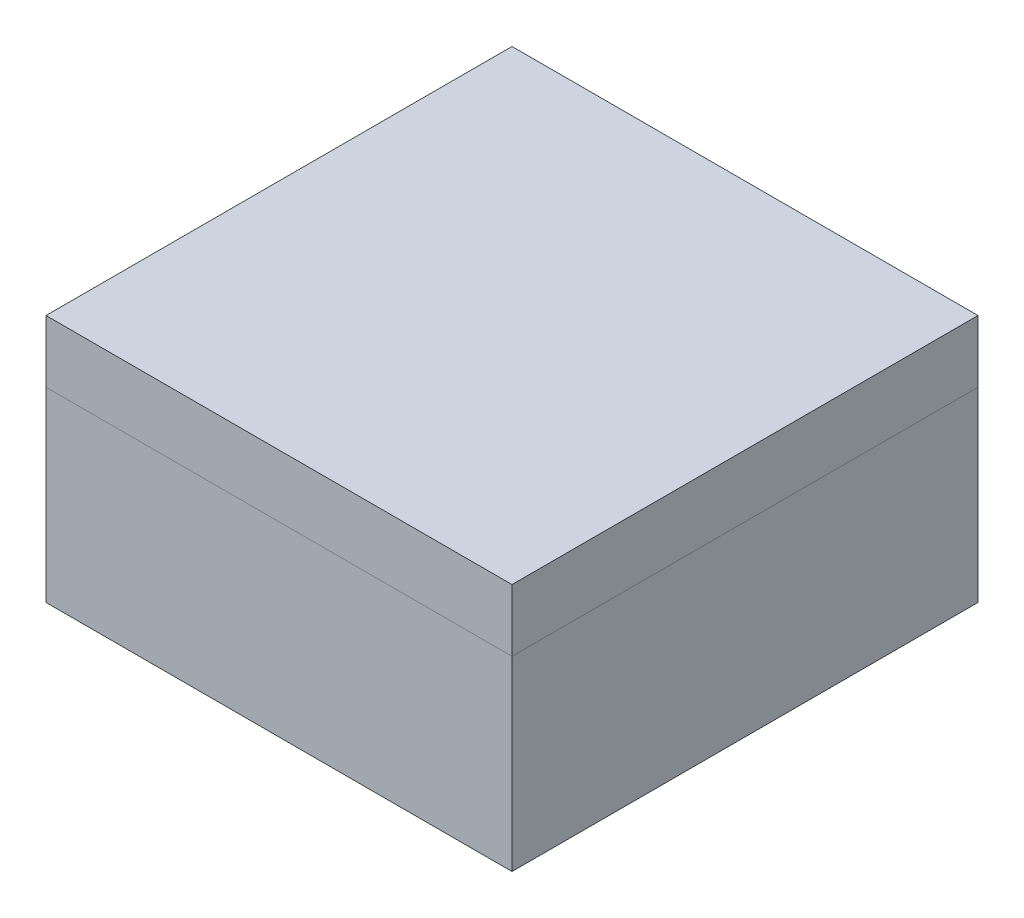
ISO-10303-21;
HEADER;
FILE_DESCRIPTION(('STEP AP214'),'2;1');
FILE_NAME('part.step','',(''),(''),'','','');
FILE_SCHEMA(('AUTOMOTIVE_DESIGN { 1 0 10303 214 1 1 1 1 }'));
ENDSEC;
DATA;
#1=APPLICATION_CONTEXT('core data for automotive mechanical design processes');
#2=APPLICATION_PROTOCOL_DEFINITION('international standard','automotive_design',2000,#1);
#3=PRODUCT_CONTEXT('',#1,'mechanical');
#4=PRODUCT('Part','Part','',(#3));
#5=PRODUCT_RELATED_PRODUCT_CATEGORY('part','',(#4));
#6=PRODUCT_DEFINITION_FORMATION('','',#4);
#7=PRODUCT_DEFINITION_CONTEXT('part definition',#1,'design');
#8=PRODUCT_DEFINITION('design','',#6,#7);
#9=PRODUCT_DEFINITION_SHAPE('','',#8);
#10=(LENGTH_UNIT() NAMED_UNIT(*) SI_UNIT(.MILLI.,.METRE.));
#11=(NAMED_UNIT(*) PLANE_ANGLE_UNIT() SI_UNIT($,.RADIAN.));
#12=(NAMED_UNIT(*) SI_UNIT($,.STERADIAN.) SOLID_ANGLE_UNIT());
#13=UNCERTAINTY_MEASURE_WITH_UNIT(LENGTH_MEASURE(1.E-05),#10,'distance_accuracy_value','');
#14=(GEOMETRIC_REPRESENTATION_CONTEXT(3) GLOBAL_UNCERTAINTY_ASSIGNED_CONTEXT((#13)) GLOBAL_UNIT_ASSIGNED_CONTEXT((#10,
#11,#12)) REPRESENTATION_CONTEXT('',''));
#15=CARTESIAN_POINT('',(0.,0.,0.));
#16=DIRECTION('',(0.,0.,1.));
#17=DIRECTION('',(1.,0.,0.));
#18=AXIS2_PLACEMENT_3D('',#15,#16,#17);
#19=CARTESIAN_POINT('',(-7.5,8.,-7.5));
#20=DIRECTION('',(1.,0.,0.));
#21=DIRECTION('',(0.,0.,-1.));
#22=AXIS2_PLACEMENT_3D('',#19,#20,#21);
#23=PLANE('',#22);
#24=DIRECTION('',(0.,0.,1.));
#25=VECTOR('',#24,1.);
#26=CARTESIAN_POINT('',(-7.5,6.,-7.5));
#27=LINE('',#26,#25);
#28=CARTESIAN_POINT('',(-7.5,6.,-7.5));
#29=VERTEX_POINT('',#28);
#30=CARTESIAN_POINT('',(-7.5,6.,7.5));
#31=VERTEX_POINT('',#30);
#32=EDGE_CURVE('E111',#29,#31,#27,.T.);
#33=ORIENTED_EDGE('',*,*,#32,.T.);
#34=DIRECTION('',(0.,-1.,0.));
#35=VECTOR('',#34,1.);
#36=CARTESIAN_POINT('',(-7.5,8.,7.5));
#37=LINE('',#36,#35);
#38=CARTESIAN_POINT('',(-7.5,8.,7.5));
#39=VERTEX_POINT('',#38);
#40=EDGE_CURVE('E12',#39,#31,#37,.T.);
#41=ORIENTED_EDGE('',*,*,#40,.F.);
#42=DIRECTION('',(0.,0.,1.));
#43=VECTOR('',#42,1.);
#44=CARTESIAN_POINT('',(-7.5,8.,-7.5));
#45=LINE('',#44,#43);
#46=CARTESIAN_POINT('',(-7.5,8.,-7.5));
#47=VERTEX_POINT('',#46);
#48=EDGE_CURVE('E99',#47,#39,#45,.T.);
#49=ORIENTED_EDGE('',*,*,#48,.F.);
#50=DIRECTION('',(0.,-1.,0.));
#51=VECTOR('',#50,1.);
#52=CARTESIAN_POINT('',(-7.5,8.,-7.5));
#53=LINE('',#52,#51);
#54=EDGE_CURVE('E107',#47,#29,#53,.T.);
#55=ORIENTED_EDGE('',*,*,#54,.T.);
#56=EDGE_LOOP('',(#33,#41,#49,#55));
#57=FACE_BOUND('',#56,.T.);
#58=ADVANCED_FACE('F48',(#57),#23,.F.);
#59=CARTESIAN_POINT('',(-7.5,8.,7.5));
#60=DIRECTION('',(0.,0.,-1.));
#61=DIRECTION('',(-1.,0.,0.));
#62=AXIS2_PLACEMENT_3D('',#59,#60,#61);
#63=PLANE('',#62);
#64=DIRECTION('',(1.,0.,0.));
#65=VECTOR('',#64,1.);
#66=CARTESIAN_POINT('',(-7.5,6.,7.5));
#67=LINE('',#66,#65);
#68=CARTESIAN_POINT('',(7.5,6.,7.5));
#69=VERTEX_POINT('',#68);
#70=EDGE_CURVE('E103',#31,#69,#67,.T.);
#71=ORIENTED_EDGE('',*,*,#70,.T.);
#72=DIRECTION('',(0.,-1.,0.));
#73=VECTOR('',#72,1.);
#74=CARTESIAN_POINT('',(7.5,8.,7.5));
#75=LINE('',#74,#73);
#76=CARTESIAN_POINT('',(7.5,8.,7.5));
#77=VERTEX_POINT('',#76);
#78=EDGE_CURVE('E56',#77,#69,#75,.T.);
#79=ORIENTED_EDGE('',*,*,#78,.F.);
#80=DIRECTION('',(1.,0.,0.));
#81=VECTOR('',#80,1.);
#82=CARTESIAN_POINT('',(-7.5,8.,7.5));
#83=LINE('',#82,#81);
#84=EDGE_CURVE('E94',#39,#77,#83,.T.);
#85=ORIENTED_EDGE('',*,*,#84,.F.);
#86=ORIENTED_EDGE('',*,*,#40,.T.);
#87=EDGE_LOOP('',(#71,#79,#85,#86));
#88=FACE_BOUND('',#87,.T.);
#89=ADVANCED_FACE('F102',(#88),#63,.F.);
#90=CARTESIAN_POINT('',(7.5,8.,7.5));
#91=DIRECTION('',(-1.,0.,0.));
#92=DIRECTION('',(0.,0.,1.));
#93=AXIS2_PLACEMENT_3D('',#90,#91,#92);
#94=PLANE('',#93);
#95=DIRECTION('',(0.,0.,-1.));
#96=VECTOR('',#95,1.);
#97=CARTESIAN_POINT('',(7.5,6.,7.5));
#98=LINE('',#97,#96);
#99=CARTESIAN_POINT('',(7.5,6.,-7.5));
#100=VERTEX_POINT('',#99);
#101=EDGE_CURVE('E81',#69,#100,#98,.T.);
#102=ORIENTED_EDGE('',*,*,#101,.T.);
#103=DIRECTION('',(0.,-1.,0.));
#104=VECTOR('',#103,1.);
#105=CARTESIAN_POINT('',(7.5,8.,-7.5));
#106=LINE('',#105,#104);
#107=CARTESIAN_POINT('',(7.5,8.,-7.5));
#108=VERTEX_POINT('',#107);
#109=EDGE_CURVE('E104',#108,#100,#106,.T.);
#110=ORIENTED_EDGE('',*,*,#109,.F.);
#111=DIRECTION('',(0.,0.,-1.));
#112=VECTOR('',#111,1.);
#113=CARTESIAN_POINT('',(7.5,8.,7.5));
#114=LINE('',#113,#112);
#115=EDGE_CURVE('E97',#77,#108,#114,.T.);
#116=ORIENTED_EDGE('',*,*,#115,.F.);
#117=ORIENTED_EDGE('',*,*,#78,.T.);
#118=EDGE_LOOP('',(#102,#110,#116,#117));
#119=FACE_BOUND('',#118,.T.);
#120=ADVANCED_FACE('F105',(#119),#94,.F.);
#121=CARTESIAN_POINT('',(7.5,8.,-7.5));
#122=DIRECTION('',(0.,0.,1.));
#123=DIRECTION('',(1.,0.,0.));
#124=AXIS2_PLACEMENT_3D('',#121,#122,#123);
#125=PLANE('',#124);
#126=DIRECTION('',(-1.,0.,0.));
#127=VECTOR('',#126,1.);
#128=CARTESIAN_POINT('',(7.5,6.,-7.5));
#129=LINE('',#128,#127);
#130=EDGE_CURVE('E87',#100,#29,#129,.T.);
#131=ORIENTED_EDGE('',*,*,#130,.T.);
#132=ORIENTED_EDGE('',*,*,#54,.F.);
#133=DIRECTION('',(-1.,0.,0.));
#134=VECTOR('',#133,1.);
#135=CARTESIAN_POINT('',(7.5,8.,-7.5));
#136=LINE('',#135,#134);
#137=EDGE_CURVE('E64',#108,#47,#136,.T.);
#138=ORIENTED_EDGE('',*,*,#137,.F.);
#139=ORIENTED_EDGE('',*,*,#109,.T.);
#140=EDGE_LOOP('',(#131,#132,#138,#139));
#141=FACE_BOUND('',#140,.T.);
#142=ADVANCED_FACE('F118',(#141),#125,.F.);
#143=CARTESIAN_POINT('',(0.,8.,0.));
#144=DIRECTION('',(0.,1.,0.));
#145=DIRECTION('',(0.,0.,1.));
#146=AXIS2_PLACEMENT_3D('',#143,#144,#145);
#147=PLANE('',#146);
#148=ORIENTED_EDGE('',*,*,#48,.T.);
#149=ORIENTED_EDGE('',*,*,#84,.T.);
#150=ORIENTED_EDGE('',*,*,#115,.T.);
#151=ORIENTED_EDGE('',*,*,#137,.T.);
#152=EDGE_LOOP('',(#148,#149,#150,#151));
#153=FACE_BOUND('',#152,.T.);
#154=ADVANCED_FACE('F95',(#153),#147,.T.);
#155=CARTESIAN_POINT('',(0.,6.,0.));
#156=DIRECTION('',(0.,1.,0.));
#157=DIRECTION('',(0.,0.,1.));
#158=AXIS2_PLACEMENT_3D('',#155,#156,#157);
#159=PLANE('',#158);
#160=ORIENTED_EDGE('',*,*,#32,.F.);
#161=ORIENTED_EDGE('',*,*,#130,.F.);
#162=ORIENTED_EDGE('',*,*,#101,.F.);
#163=ORIENTED_EDGE('',*,*,#70,.F.);
#164=EDGE_LOOP('',(#160,#161,#162,#163));
#165=FACE_BOUND('',#164,.T.);
#166=ADVANCED_FACE('F121',(#165),#159,.F.);
#167=CLOSED_SHELL('',(#58,#89,#120,#142,#154,#166));
#168=MANIFOLD_SOLID_BREP('B2',#167);
#169=CARTESIAN_POINT('',(7.5,5.,7.5));
#170=DIRECTION('',(-1.,0.,0.));
#171=DIRECTION('',(0.,0.,1.));
#172=AXIS2_PLACEMENT_3D('',#169,#170,#171);
#173=PLANE('',#172);
#174=DIRECTION('',(0.,0.,-1.));
#175=VECTOR('',#174,1.);
#176=CARTESIAN_POINT('',(7.5,0.,7.5));
#177=LINE('',#176,#175);
#178=CARTESIAN_POINT('',(7.5,0.,7.5));
#179=VERTEX_POINT('',#178);
#180=CARTESIAN_POINT('',(7.5,0.,-7.5));
#181=VERTEX_POINT('',#180);
#182=EDGE_CURVE('E249',#179,#181,#177,.T.);
#183=ORIENTED_EDGE('',*,*,#182,.T.);
#184=DIRECTION('',(0.,-1.,0.));
#185=VECTOR('',#184,1.);
#186=CARTESIAN_POINT('',(7.5,5.,-7.5));
#187=LINE('',#186,#185);
#188=CARTESIAN_POINT('',(7.5,6.,-7.5));
#189=VERTEX_POINT('',#188);
#190=EDGE_CURVE('E46',#189,#181,#187,.T.);
#191=ORIENTED_EDGE('',*,*,#190,.F.);
#192=DIRECTION('',(0.,0.,-1.));
#193=VECTOR('',#192,1.);
#194=CARTESIAN_POINT('',(7.5,6.,7.5));
#195=LINE('',#194,#193);
#196=CARTESIAN_POINT('',(7.5,6.,7.5));
#197=VERTEX_POINT('',#196);
#198=EDGE_CURVE('E232',#197,#189,#195,.T.);
#199=ORIENTED_EDGE('',*,*,#198,.F.);
#200=DIRECTION('',(0.,-1.,0.));
#201=VECTOR('',#200,1.);
#202=CARTESIAN_POINT('',(7.5,5.,7.5));
#203=LINE('',#202,#201);
#204=EDGE_CURVE('E221',#197,#179,#203,.T.);
#205=ORIENTED_EDGE('',*,*,#204,.T.);
#206=EDGE_LOOP('',(#183,#191,#199,#205));
#207=FACE_BOUND('',#206,.T.);
#208=ADVANCED_FACE('F181',(#207),#173,.F.);
#209=CARTESIAN_POINT('',(-7.5,5.,-7.5));
#210=DIRECTION('',(0.,0.,1.));
#211=DIRECTION('',(1.,0.,0.));
#212=AXIS2_PLACEMENT_3D('',#209,#210,#211);
#213=PLANE('',#212);
#214=DIRECTION('',(-1.,0.,0.));
#215=VECTOR('',#214,1.);
#216=CARTESIAN_POINT('',(-7.5,0.,-7.5));
#217=LINE('',#216,#215);
#218=CARTESIAN_POINT('',(-7.5,0.,-7.5));
#219=VERTEX_POINT('',#218);
#220=EDGE_CURVE('E251',#181,#219,#217,.T.);
#221=ORIENTED_EDGE('',*,*,#220,.T.);
#222=DIRECTION('',(0.,-1.,0.));
#223=VECTOR('',#222,1.);
#224=CARTESIAN_POINT('',(-7.5,5.,-7.5));
#225=LINE('',#224,#223);
#226=CARTESIAN_POINT('',(-7.5,6.,-7.5));
#227=VERTEX_POINT('',#226);
#228=EDGE_CURVE('E189',#227,#219,#225,.T.);
#229=ORIENTED_EDGE('',*,*,#228,.F.);
#230=DIRECTION('',(-1.,0.,0.));
#231=VECTOR('',#230,1.);
#232=CARTESIAN_POINT('',(7.5,6.,-7.5));
#233=LINE('',#232,#231);
#234=EDGE_CURVE('E236',#189,#227,#233,.T.);
#235=ORIENTED_EDGE('',*,*,#234,.F.);
#236=ORIENTED_EDGE('',*,*,#190,.T.);
#237=EDGE_LOOP('',(#221,#229,#235,#236));
#238=FACE_BOUND('',#237,.T.);
#239=ADVANCED_FACE('F260',(#238),#213,.F.);
#240=CARTESIAN_POINT('',(-7.5,5.,7.5));
#241=DIRECTION('',(1.,0.,0.));
#242=DIRECTION('',(0.,0.,-1.));
#243=AXIS2_PLACEMENT_3D('',#240,#241,#242);
#244=PLANE('',#243);
#245=DIRECTION('',(0.,0.,1.));
#246=VECTOR('',#245,1.);
#247=CARTESIAN_POINT('',(-7.5,0.,7.5));
#248=LINE('',#247,#246);
#249=CARTESIAN_POINT('',(-7.5,0.,7.5));
#250=VERTEX_POINT('',#249);
#251=EDGE_CURVE('E204',#219,#250,#248,.T.);
#252=ORIENTED_EDGE('',*,*,#251,.T.);
#253=DIRECTION('',(0.,-1.,0.));
#254=VECTOR('',#253,1.);
#255=CARTESIAN_POINT('',(-7.5,5.,7.5));
#256=LINE('',#255,#254);
#257=CARTESIAN_POINT('',(-7.5,6.,7.5));
#258=VERTEX_POINT('',#257);
#259=EDGE_CURVE('E229',#258,#250,#256,.T.);
#260=ORIENTED_EDGE('',*,*,#259,.F.);
#261=DIRECTION('',(0.,0.,1.));
#262=VECTOR('',#261,1.);
#263=CARTESIAN_POINT('',(-7.5,6.,-7.5));
#264=LINE('',#263,#262);
#265=EDGE_CURVE('E241',#227,#258,#264,.T.);
#266=ORIENTED_EDGE('',*,*,#265,.F.);
#267=ORIENTED_EDGE('',*,*,#228,.T.);
#268=EDGE_LOOP('',(#252,#260,#266,#267));
#269=FACE_BOUND('',#268,.T.);
#270=ADVANCED_FACE('F256',(#269),#244,.F.);
#271=CARTESIAN_POINT('',(-7.5,5.,7.5));
#272=DIRECTION('',(0.,0.,-1.));
#273=DIRECTION('',(-1.,0.,0.));
#274=AXIS2_PLACEMENT_3D('',#271,#272,#273);
#275=PLANE('',#274);
#276=DIRECTION('',(1.,0.,0.));
#277=VECTOR('',#276,1.);
#278=CARTESIAN_POINT('',(-7.5,0.,7.5));
#279=LINE('',#278,#277);
#280=EDGE_CURVE('E196',#250,#179,#279,.T.);
#281=ORIENTED_EDGE('',*,*,#280,.T.);
#282=ORIENTED_EDGE('',*,*,#204,.F.);
#283=DIRECTION('',(1.,0.,0.));
#284=VECTOR('',#283,1.);
#285=CARTESIAN_POINT('',(-7.5,6.,7.5));
#286=LINE('',#285,#284);
#287=EDGE_CURVE('E225',#258,#197,#286,.T.);
#288=ORIENTED_EDGE('',*,*,#287,.F.);
#289=ORIENTED_EDGE('',*,*,#259,.T.);
#290=EDGE_LOOP('',(#281,#282,#288,#289));
#291=FACE_BOUND('',#290,.T.);
#292=ADVANCED_FACE('F223',(#291),#275,.F.);
#293=CARTESIAN_POINT('',(0.,0.,0.));
#294=DIRECTION('',(0.,-1.,0.));
#295=DIRECTION('',(0.,0.,-1.));
#296=AXIS2_PLACEMENT_3D('',#293,#294,#295);
#297=PLANE('',#296);
#298=CARTESIAN_POINT('',(0.,0.,0.));
#299=DIRECTION('',(0.,-1.,0.));
#300=DIRECTION('',(0.,0.,-1.));
#301=AXIS2_PLACEMENT_3D('',#298,#299,#300);
#302=CIRCLE('',#301,4.1);
#303=CARTESIAN_POINT('',(0.,0.,-4.1));
#304=VERTEX_POINT('',#303);
#305=EDGE_CURVE('E184',#304,#304,#302,.T.);
#306=ORIENTED_EDGE('',*,*,#305,.F.);
#307=EDGE_LOOP('',(#306));
#308=FACE_BOUND('',#307,.T.);
#309=ORIENTED_EDGE('',*,*,#182,.F.);
#310=ORIENTED_EDGE('',*,*,#280,.F.);
#311=ORIENTED_EDGE('',*,*,#251,.F.);
#312=ORIENTED_EDGE('',*,*,#220,.F.);
#313=EDGE_LOOP('',(#309,#310,#311,#312));
#314=FACE_BOUND('',#313,.T.);
#315=ADVANCED_FACE('F259',(#308,#314),#297,.T.);
#316=CARTESIAN_POINT('',(0.,-1.,0.));
#317=DIRECTION('',(0.,1.,0.));
#318=DIRECTION('',(0.,0.,1.));
#319=AXIS2_PLACEMENT_3D('',#316,#317,#318);
#320=CYLINDRICAL_SURFACE('',#319,4.1);
#321=ORIENTED_EDGE('',*,*,#305,.T.);
#322=EDGE_LOOP('',(#321));
#323=FACE_BOUND('',#322,.T.);
#324=CARTESIAN_POINT('',(0.,5.,0.));
#325=DIRECTION('',(0.,1.,0.));
#326=DIRECTION('',(0.,0.,1.));
#327=AXIS2_PLACEMENT_3D('',#324,#325,#326);
#328=CIRCLE('',#327,4.1);
#329=CARTESIAN_POINT('',(0.,5.,4.1));
#330=VERTEX_POINT('',#329);
#331=EDGE_CURVE('E246',#330,#330,#328,.T.);
#332=ORIENTED_EDGE('',*,*,#331,.T.);
#333=EDGE_LOOP('',(#332));
#334=FACE_BOUND('',#333,.T.);
#335=ADVANCED_FACE('F272',(#323,#334),#320,.F.);
#336=CARTESIAN_POINT('',(0.,5.,0.));
#337=DIRECTION('',(0.,1.,0.));
#338=DIRECTION('',(0.,0.,1.));
#339=AXIS2_PLACEMENT_3D('',#336,#337,#338);
#340=PLANE('',#339);
#341=ORIENTED_EDGE('',*,*,#331,.F.);
#342=EDGE_LOOP('',(#341));
#343=FACE_BOUND('',#342,.T.);
#344=ADVANCED_FACE('F276',(#343),#340,.F.);
#345=CARTESIAN_POINT('',(0.,6.,0.));
#346=DIRECTION('',(0.,1.,0.));
#347=DIRECTION('',(0.,0.,1.));
#348=AXIS2_PLACEMENT_3D('',#345,#346,#347);
#349=PLANE('',#348);
#350=ORIENTED_EDGE('',*,*,#287,.T.);
#351=ORIENTED_EDGE('',*,*,#198,.T.);
#352=ORIENTED_EDGE('',*,*,#234,.T.);
#353=ORIENTED_EDGE('',*,*,#265,.T.);
#354=EDGE_LOOP('',(#350,#351,#352,#353));
#355=FACE_BOUND('',#354,.T.);
#356=ADVANCED_FACE('F239',(#355),#349,.T.);
#357=CLOSED_SHELL('',(#208,#239,#270,#292,#315,#335,#344,#356));
#358=MANIFOLD_SOLID_BREP('B6',#357);
#359=ADVANCED_BREP_SHAPE_REPRESENTATION('',(#18,#168,#358),#14);
#360=SHAPE_DEFINITION_REPRESENTATION(#9,#359);
ENDSEC;
END-ISO-10303-21;
